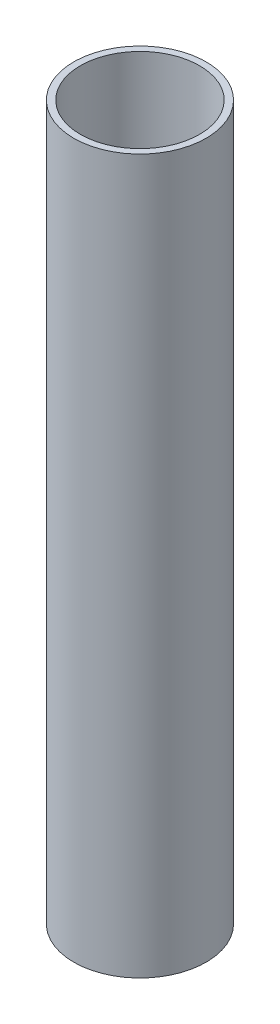
ISO-10303-21;
HEADER;
FILE_DESCRIPTION(('STEP AP214'),'2;1');
FILE_NAME('part.step','',(''),(''),'','','');
FILE_SCHEMA(('AUTOMOTIVE_DESIGN { 1 0 10303 214 1 1 1 1 }'));
ENDSEC;
DATA;
#1=APPLICATION_CONTEXT('core data for automotive mechanical design processes');
#2=APPLICATION_PROTOCOL_DEFINITION('international standard','automotive_design',2000,#1);
#3=PRODUCT_CONTEXT('',#1,'mechanical');
#4=PRODUCT('Part','Part','',(#3));
#5=PRODUCT_RELATED_PRODUCT_CATEGORY('part','',(#4));
#6=PRODUCT_DEFINITION_FORMATION('','',#4);
#7=PRODUCT_DEFINITION_CONTEXT('part definition',#1,'design');
#8=PRODUCT_DEFINITION('design','',#6,#7);
#9=PRODUCT_DEFINITION_SHAPE('','',#8);
#10=(LENGTH_UNIT() NAMED_UNIT(*) SI_UNIT(.MILLI.,.METRE.));
#11=(NAMED_UNIT(*) PLANE_ANGLE_UNIT() SI_UNIT($,.RADIAN.));
#12=(NAMED_UNIT(*) SI_UNIT($,.STERADIAN.) SOLID_ANGLE_UNIT());
#13=UNCERTAINTY_MEASURE_WITH_UNIT(LENGTH_MEASURE(1.E-05),#10,'distance_accuracy_value','');
#14=(GEOMETRIC_REPRESENTATION_CONTEXT(3) GLOBAL_UNCERTAINTY_ASSIGNED_CONTEXT((#13)) GLOBAL_UNIT_ASSIGNED_CONTEXT((#10,
#11,#12)) REPRESENTATION_CONTEXT('',''));
#15=CARTESIAN_POINT('',(0.,0.,0.));
#16=DIRECTION('',(0.,0.,1.));
#17=DIRECTION('',(1.,0.,0.));
#18=AXIS2_PLACEMENT_3D('',#15,#16,#17);
#19=CARTESIAN_POINT('',(0.,107.8,0.));
#20=DIRECTION('',(0.,1.,0.));
#21=DIRECTION('',(0.,0.,1.));
#22=AXIS2_PLACEMENT_3D('',#19,#20,#21);
#23=PLANE('',#22);
#24=CARTESIAN_POINT('',(0.,107.8,0.));
#25=DIRECTION('',(0.,1.,0.));
#26=DIRECTION('',(0.,0.,1.));
#27=AXIS2_PLACEMENT_3D('',#24,#25,#26);
#28=CIRCLE('',#27,10.);
#29=CARTESIAN_POINT('',(0.,107.8,10.));
#30=VERTEX_POINT('',#29);
#31=EDGE_CURVE('E10',#30,#30,#28,.T.);
#32=ORIENTED_EDGE('',*,*,#31,.T.);
#33=EDGE_LOOP('',(#32));
#34=FACE_BOUND('',#33,.T.);
#35=CARTESIAN_POINT('',(0.,107.8,0.));
#36=DIRECTION('',(0.,1.,0.));
#37=DIRECTION('',(0.,0.,1.));
#38=AXIS2_PLACEMENT_3D('',#35,#36,#37);
#39=CIRCLE('',#38,9.);
#40=CARTESIAN_POINT('',(0.,107.8,9.));
#41=VERTEX_POINT('',#40);
#42=EDGE_CURVE('E52',#41,#41,#39,.T.);
#43=ORIENTED_EDGE('',*,*,#42,.F.);
#44=EDGE_LOOP('',(#43));
#45=FACE_BOUND('',#44,.T.);
#46=ADVANCED_FACE('F39',(#34,#45),#23,.T.);
#47=CARTESIAN_POINT('',(0.,0.,0.));
#48=DIRECTION('',(0.,1.,0.));
#49=DIRECTION('',(0.,0.,1.));
#50=AXIS2_PLACEMENT_3D('',#47,#48,#49);
#51=PLANE('',#50);
#52=CARTESIAN_POINT('',(0.,0.,0.));
#53=DIRECTION('',(0.,1.,0.));
#54=DIRECTION('',(0.,0.,1.));
#55=AXIS2_PLACEMENT_3D('',#52,#53,#54);
#56=CIRCLE('',#55,10.);
#57=CARTESIAN_POINT('',(0.,0.,10.));
#58=VERTEX_POINT('',#57);
#59=EDGE_CURVE('E43',#58,#58,#56,.T.);
#60=ORIENTED_EDGE('',*,*,#59,.F.);
#61=EDGE_LOOP('',(#60));
#62=FACE_BOUND('',#61,.T.);
#63=CARTESIAN_POINT('',(0.,0.,0.));
#64=DIRECTION('',(0.,1.,0.));
#65=DIRECTION('',(0.,0.,1.));
#66=AXIS2_PLACEMENT_3D('',#63,#64,#65);
#67=CIRCLE('',#66,9.);
#68=CARTESIAN_POINT('',(0.,0.,9.));
#69=VERTEX_POINT('',#68);
#70=EDGE_CURVE('E54',#69,#69,#67,.T.);
#71=ORIENTED_EDGE('',*,*,#70,.T.);
#72=EDGE_LOOP('',(#71));
#73=FACE_BOUND('',#72,.T.);
#74=ADVANCED_FACE('F66',(#62,#73),#51,.F.);
#75=CARTESIAN_POINT('',(0.,107.8,0.));
#76=DIRECTION('',(0.,-1.,0.));
#77=DIRECTION('',(0.,0.,-1.));
#78=AXIS2_PLACEMENT_3D('',#75,#76,#77);
#79=CYLINDRICAL_SURFACE('',#78,10.);
#80=ORIENTED_EDGE('',*,*,#31,.F.);
#81=EDGE_LOOP('',(#80));
#82=FACE_BOUND('',#81,.T.);
#83=ORIENTED_EDGE('',*,*,#59,.T.);
#84=EDGE_LOOP('',(#83));
#85=FACE_BOUND('',#84,.T.);
#86=ADVANCED_FACE('F41',(#82,#85),#79,.T.);
#87=CARTESIAN_POINT('',(0.,107.8,0.));
#88=DIRECTION('',(0.,-1.,0.));
#89=DIRECTION('',(0.,0.,-1.));
#90=AXIS2_PLACEMENT_3D('',#87,#88,#89);
#91=CYLINDRICAL_SURFACE('',#90,9.);
#92=ORIENTED_EDGE('',*,*,#42,.T.);
#93=EDGE_LOOP('',(#92));
#94=FACE_BOUND('',#93,.T.);
#95=ORIENTED_EDGE('',*,*,#70,.F.);
#96=EDGE_LOOP('',(#95));
#97=FACE_BOUND('',#96,.T.);
#98=ADVANCED_FACE('F62',(#94,#97),#91,.F.);
#99=CLOSED_SHELL('',(#46,#74,#86,#98));
#100=MANIFOLD_SOLID_BREP('B2',#99);
#101=ADVANCED_BREP_SHAPE_REPRESENTATION('',(#18,#100),#14);
#102=SHAPE_DEFINITION_REPRESENTATION(#9,#101);
ENDSEC;
END-ISO-10303-21;
